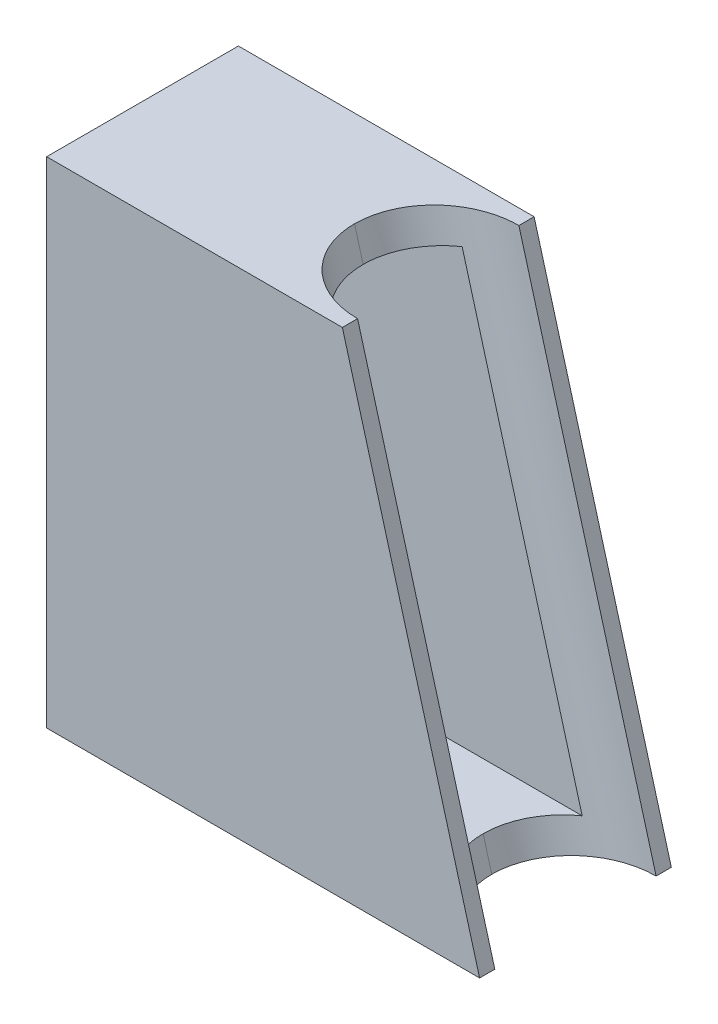
ISO-10303-21;
HEADER;
FILE_DESCRIPTION(('STEP AP214'),'2;1');
FILE_NAME('part.step','',(''),(''),'','','');
FILE_SCHEMA(('AUTOMOTIVE_DESIGN { 1 0 10303 214 1 1 1 1 }'));
ENDSEC;
DATA;
#1=APPLICATION_CONTEXT('core data for automotive mechanical design processes');
#2=APPLICATION_PROTOCOL_DEFINITION('international standard','automotive_design',2000,#1);
#3=PRODUCT_CONTEXT('',#1,'mechanical');
#4=PRODUCT('Part','Part','',(#3));
#5=PRODUCT_RELATED_PRODUCT_CATEGORY('part','',(#4));
#6=PRODUCT_DEFINITION_FORMATION('','',#4);
#7=PRODUCT_DEFINITION_CONTEXT('part definition',#1,'design');
#8=PRODUCT_DEFINITION('design','',#6,#7);
#9=PRODUCT_DEFINITION_SHAPE('','',#8);
#10=(LENGTH_UNIT() NAMED_UNIT(*) SI_UNIT(.MILLI.,.METRE.));
#11=(NAMED_UNIT(*) PLANE_ANGLE_UNIT() SI_UNIT($,.RADIAN.));
#12=(NAMED_UNIT(*) SI_UNIT($,.STERADIAN.) SOLID_ANGLE_UNIT());
#13=UNCERTAINTY_MEASURE_WITH_UNIT(LENGTH_MEASURE(1.E-05),#10,'distance_accuracy_value','');
#14=(GEOMETRIC_REPRESENTATION_CONTEXT(3) GLOBAL_UNCERTAINTY_ASSIGNED_CONTEXT((#13)) GLOBAL_UNIT_ASSIGNED_CONTEXT((#10,
#11,#12)) REPRESENTATION_CONTEXT('',''));
#15=CARTESIAN_POINT('',(0.,0.,0.));
#16=DIRECTION('',(0.,0.,1.));
#17=DIRECTION('',(1.,0.,0.));
#18=AXIS2_PLACEMENT_3D('',#15,#16,#17);
#19=CARTESIAN_POINT('',(-5.55237226107323,-65.915590084916,15.5));
#20=DIRECTION('',(-0.267261394991058,0.963624069203044,0.));
#21=DIRECTION('',(-0.963624069203044,-0.267261394991058,0.));
#22=AXIS2_PLACEMENT_3D('',#19,#20,#21);
#23=CYLINDRICAL_SURFACE('',#22,13.0414448701443);
#24=DIRECTION('',(-0.267261394991058,0.963624069203044,0.));
#25=VECTOR('',#24,1.);
#26=CARTESIAN_POINT('',(-18.1194224351289,-69.4010648336098,15.5));
#27=LINE('',#26,#25);
#28=CARTESIAN_POINT('',(-19.0861197949327,-65.915590084916,15.5));
#29=VERTEX_POINT('',#28);
#30=CARTESIAN_POINT('',(-20.4728711408808,-60.915590084916,15.5));
#31=VERTEX_POINT('',#30);
#32=EDGE_CURVE('E249',#29,#31,#27,.T.);
#33=ORIENTED_EDGE('',*,*,#32,.F.);
#34=CARTESIAN_POINT('',(-5.55237226107325,-65.915590084916,2.45855512985572));
#35=CARTESIAN_POINT('',(-13.4802580166747,-65.9155900849159,2.45855512985571));
#36=CARTESIAN_POINT('',(-19.0861197949327,-65.9155900849159,7.8604984680105));
#37=CARTESIAN_POINT('',(-19.0861197949327,-65.915590084916,15.5));
#38=(BOUNDED_CURVE() B_SPLINE_CURVE(3,(#34,#35,#36,#37),.UNSPECIFIED.,.F.,
.F.) B_SPLINE_CURVE_WITH_KNOTS((4,4),(4.71238898038469,6.28318530717959),
.UNSPECIFIED.) CURVE() GEOMETRIC_REPRESENTATION_ITEM() RATIONAL_B_SPLINE_CURVE((1.,
0.804737854124365,0.804737854124365,1.)) REPRESENTATION_ITEM(''));
#39=CARTESIAN_POINT('',(-5.55237226107325,-65.915590084916,2.45855512985572));
#40=VERTEX_POINT('',#39);
#41=EDGE_CURVE('E215',#40,#29,#38,.T.);
#42=ORIENTED_EDGE('',*,*,#41,.F.);
#43=DIRECTION('',(0.267261394991058,-0.963624069203044,0.));
#44=VECTOR('',#43,1.);
#45=CARTESIAN_POINT('',(-5.55237226107325,-65.915590084916,2.45855512985572));
#46=LINE('',#45,#44);
#47=CARTESIAN_POINT('',(-27.7403937962426,14.084409915084,2.45855512985572));
#48=VERTEX_POINT('',#47);
#49=EDGE_CURVE('E200',#48,#40,#46,.T.);
#50=ORIENTED_EDGE('',*,*,#49,.F.);
#51=CARTESIAN_POINT('',(-41.274141330102,14.084409915084,15.5));
#52=CARTESIAN_POINT('',(-41.274141330102,14.084409915084,7.8604984680105));
#53=CARTESIAN_POINT('',(-35.668279551844,14.084409915084,2.45855512985572));
#54=CARTESIAN_POINT('',(-27.7403937962426,14.084409915084,2.45855512985572));
#55=(BOUNDED_CURVE() B_SPLINE_CURVE(3,(#51,#52,#53,#54),.UNSPECIFIED.,.F.,
.F.) B_SPLINE_CURVE_WITH_KNOTS((4,4),(0.,1.5707963267949),
.UNSPECIFIED.) CURVE() GEOMETRIC_REPRESENTATION_ITEM() RATIONAL_B_SPLINE_CURVE((1.,
0.804737854124365,0.804737854124365,1.)) REPRESENTATION_ITEM(''));
#56=CARTESIAN_POINT('',(-41.274141330102,14.084409915084,15.5));
#57=VERTEX_POINT('',#56);
#58=EDGE_CURVE('E11',#57,#48,#55,.T.);
#59=ORIENTED_EDGE('',*,*,#58,.F.);
#60=DIRECTION('',(-0.267261394991058,0.963624069203044,0.));
#61=VECTOR('',#60,1.);
#62=CARTESIAN_POINT('',(-18.1194224351289,-69.4010648336098,15.5));
#63=LINE('',#62,#61);
#64=CARTESIAN_POINT('',(-39.8873899841539,9.08440991508401,15.5));
#65=VERTEX_POINT('',#64);
#66=EDGE_CURVE('E195',#65,#57,#63,.T.);
#67=ORIENTED_EDGE('',*,*,#66,.F.);
#68=CARTESIAN_POINT('',(-34.3805685504365,9.08440991508402,5.));
#69=CARTESIAN_POINT('',(-37.9100720905667,9.08440991508401,7.50546803179821));
#70=CARTESIAN_POINT('',(-39.8873899841539,9.08440991508401,11.2756716115883));
#71=CARTESIAN_POINT('',(-39.8873899841539,9.08440991508401,15.5));
#72=(BOUNDED_CURVE() B_SPLINE_CURVE(3,(#68,#69,#70,#71),.UNSPECIFIED.,.F.,
.F.) B_SPLINE_CURVE_WITH_KNOTS((4,4),(5.34729824784093,6.28318530717959),
.UNSPECIFIED.) CURVE() GEOMETRIC_REPRESENTATION_ITEM() RATIONAL_B_SPLINE_CURVE((1.,
0.928331832997427,0.928331832997427,1.)) REPRESENTATION_ITEM(''));
#73=CARTESIAN_POINT('',(-34.3805685504365,9.08440991508402,5.));
#74=VERTEX_POINT('',#73);
#75=EDGE_CURVE('E41',#74,#65,#72,.T.);
#76=ORIENTED_EDGE('',*,*,#75,.F.);
#77=DIRECTION('',(-0.267261394991058,0.963624069203044,0.));
#78=VECTOR('',#77,1.);
#79=CARTESIAN_POINT('',(-13.0059458401242,-67.9828407234904,5.));
#80=LINE('',#79,#78);
#81=CARTESIAN_POINT('',(-14.9660497071633,-60.915590084916,5.));
#82=VERTEX_POINT('',#81);
#83=EDGE_CURVE('E164',#82,#74,#80,.T.);
#84=ORIENTED_EDGE('',*,*,#83,.F.);
#85=CARTESIAN_POINT('',(-20.4728711408808,-60.915590084916,15.5));
#86=CARTESIAN_POINT('',(-20.4728711408808,-60.9155900849159,11.2756716115883));
#87=CARTESIAN_POINT('',(-18.4955532472935,-60.9155900849159,7.50546803179821));
#88=CARTESIAN_POINT('',(-14.9660497071633,-60.915590084916,5.));
#89=(BOUNDED_CURVE() B_SPLINE_CURVE(3,(#85,#86,#87,#88),.UNSPECIFIED.,.F.,
.F.) B_SPLINE_CURVE_WITH_KNOTS((4,4),(0.,0.935887059338653),
.UNSPECIFIED.) CURVE() GEOMETRIC_REPRESENTATION_ITEM() RATIONAL_B_SPLINE_CURVE((1.,
0.928331832997427,0.928331832997427,1.)) REPRESENTATION_ITEM(''));
#90=EDGE_CURVE('E54',#31,#82,#89,.T.);
#91=ORIENTED_EDGE('',*,*,#90,.F.);
#92=EDGE_LOOP('',(#33,#42,#50,#59,#67,#76,#84,#91));
#93=FACE_BOUND('',#92,.T.);
#94=ADVANCED_FACE('F17',(#93),#23,.F.);
#95=CARTESIAN_POINT('',(34.4476277389267,14.084409915084,-21.0430808616771));
#96=DIRECTION('',(0.,-1.,0.));
#97=DIRECTION('',(0.,0.,-1.));
#98=AXIS2_PLACEMENT_3D('',#95,#96,#97);
#99=PLANE('',#98);
#100=DIRECTION('',(0.,0.,1.));
#101=VECTOR('',#100,1.);
#102=CARTESIAN_POINT('',(-27.7403937962426,14.084409915084,31.));
#103=LINE('',#102,#101);
#104=CARTESIAN_POINT('',(-27.7403937962426,14.084409915084,28.5414448701443));
#105=VERTEX_POINT('',#104);
#106=CARTESIAN_POINT('',(-27.7403937962426,14.084409915084,31.));
#107=VERTEX_POINT('',#106);
#108=EDGE_CURVE('E235',#105,#107,#103,.T.);
#109=ORIENTED_EDGE('',*,*,#108,.F.);
#110=CARTESIAN_POINT('',(-27.7403937962426,14.084409915084,28.5414448701443));
#111=CARTESIAN_POINT('',(-35.668279551844,14.084409915084,28.5414448701443));
#112=CARTESIAN_POINT('',(-41.274141330102,14.084409915084,23.1395015319895));
#113=CARTESIAN_POINT('',(-41.274141330102,14.084409915084,15.5));
#114=(BOUNDED_CURVE() B_SPLINE_CURVE(3,(#110,#111,#112,#113),.UNSPECIFIED.,.F.,
.F.) B_SPLINE_CURVE_WITH_KNOTS((4,4),(4.71238898038469,6.28318530717959),
.UNSPECIFIED.) CURVE() GEOMETRIC_REPRESENTATION_ITEM() RATIONAL_B_SPLINE_CURVE((1.,
0.804737854124365,0.804737854124365,1.)) REPRESENTATION_ITEM(''));
#115=EDGE_CURVE('E198',#105,#57,#114,.T.);
#116=ORIENTED_EDGE('',*,*,#115,.T.);
#117=ORIENTED_EDGE('',*,*,#58,.T.);
#118=DIRECTION('',(0.,0.,1.));
#119=VECTOR('',#118,1.);
#120=CARTESIAN_POINT('',(-27.7403937962426,14.084409915084,31.));
#121=LINE('',#120,#119);
#122=CARTESIAN_POINT('',(-27.7403937962426,14.084409915084,0.));
#123=VERTEX_POINT('',#122);
#124=EDGE_CURVE('E203',#123,#48,#121,.T.);
#125=ORIENTED_EDGE('',*,*,#124,.F.);
#126=DIRECTION('',(1.,0.,0.));
#127=VECTOR('',#126,1.);
#128=CARTESIAN_POINT('',(0.,14.084409915084,0.));
#129=LINE('',#128,#127);
#130=CARTESIAN_POINT('',(-75.5523722610733,14.084409915084,0.));
#131=VERTEX_POINT('',#130);
#132=EDGE_CURVE('E165',#131,#123,#129,.T.);
#133=ORIENTED_EDGE('',*,*,#132,.F.);
#134=DIRECTION('',(0.,0.,1.));
#135=VECTOR('',#134,1.);
#136=CARTESIAN_POINT('',(-75.5523722610733,14.084409915084,-21.0430808616771));
#137=LINE('',#136,#135);
#138=CARTESIAN_POINT('',(-75.5523722610733,14.084409915084,31.));
#139=VERTEX_POINT('',#138);
#140=EDGE_CURVE('E189',#131,#139,#137,.T.);
#141=ORIENTED_EDGE('',*,*,#140,.T.);
#142=DIRECTION('',(1.,0.,0.));
#143=VECTOR('',#142,1.);
#144=CARTESIAN_POINT('',(0.,14.084409915084,31.));
#145=LINE('',#144,#143);
#146=EDGE_CURVE('E224',#139,#107,#145,.T.);
#147=ORIENTED_EDGE('',*,*,#146,.T.);
#148=EDGE_LOOP('',(#109,#116,#117,#125,#133,#141,#147));
#149=FACE_BOUND('',#148,.T.);
#150=ADVANCED_FACE('F364',(#149),#99,.F.);
#151=CARTESIAN_POINT('',(-60.5523722610733,-170.915590084916,14.6496389415133));
#152=DIRECTION('',(0.,1.,0.));
#153=DIRECTION('',(0.,0.,1.));
#154=AXIS2_PLACEMENT_3D('',#151,#152,#153);
#155=CYLINDRICAL_SURFACE('',#154,6.);
#156=DIRECTION('',(0.,1.,0.));
#157=VECTOR('',#156,1.);
#158=CARTESIAN_POINT('',(-60.5523722610733,-170.915590084916,8.64963894151333));
#159=LINE('',#158,#157);
#160=CARTESIAN_POINT('',(-60.5523722610733,-65.915590084916,8.64963894151336));
#161=VERTEX_POINT('',#160);
#162=CARTESIAN_POINT('',(-60.5523722610733,-60.915590084916,8.64963894151336));
#163=VERTEX_POINT('',#162);
#164=EDGE_CURVE('E287',#161,#163,#159,.T.);
#165=ORIENTED_EDGE('',*,*,#164,.F.);
#166=CARTESIAN_POINT('',(-60.5523722610733,-65.915590084916,14.6496389415134));
#167=DIRECTION('',(0.,1.,0.));
#168=DIRECTION('',(-1.,0.,0.));
#169=AXIS2_PLACEMENT_3D('',#166,#167,#168);
#170=CIRCLE('',#169,6.);
#171=CARTESIAN_POINT('',(-60.5523722610733,-65.915590084916,20.6496389415133));
#172=VERTEX_POINT('',#171);
#173=EDGE_CURVE('E273',#172,#161,#170,.T.);
#174=ORIENTED_EDGE('',*,*,#173,.F.);
#175=DIRECTION('',(0.,1.,0.));
#176=VECTOR('',#175,1.);
#177=CARTESIAN_POINT('',(-60.5523722610733,-170.915590084916,20.6496389415133));
#178=LINE('',#177,#176);
#179=CARTESIAN_POINT('',(-60.5523722610733,-60.915590084916,20.6496389415133));
#180=VERTEX_POINT('',#179);
#181=EDGE_CURVE('E243',#172,#180,#178,.T.);
#182=ORIENTED_EDGE('',*,*,#181,.T.);
#183=CARTESIAN_POINT('',(-60.5523722610733,-60.915590084916,14.6496389415134));
#184=DIRECTION('',(0.,1.,0.));
#185=DIRECTION('',(0.,0.,1.));
#186=AXIS2_PLACEMENT_3D('',#183,#184,#185);
#187=CIRCLE('',#186,6.);
#188=EDGE_CURVE('E27',#180,#163,#187,.T.);
#189=ORIENTED_EDGE('',*,*,#188,.T.);
#190=EDGE_LOOP('',(#165,#174,#182,#189));
#191=FACE_BOUND('',#190,.T.);
#192=ADVANCED_FACE('F323',(#191),#155,.F.);
#193=CARTESIAN_POINT('',(34.4476277389267,-60.915590084916,5.));
#194=DIRECTION('',(0.,-1.,0.));
#195=DIRECTION('',(0.,0.,-1.));
#196=AXIS2_PLACEMENT_3D('',#193,#194,#195);
#197=PLANE('',#196);
#198=ORIENTED_EDGE('',*,*,#188,.F.);
#199=CARTESIAN_POINT('',(-60.5523722610733,-60.915590084916,14.6496389415134));
#200=DIRECTION('',(0.,1.,0.));
#201=DIRECTION('',(0.,0.,1.));
#202=AXIS2_PLACEMENT_3D('',#199,#200,#201);
#203=CIRCLE('',#202,6.);
#204=EDGE_CURVE('E283',#163,#180,#203,.T.);
#205=ORIENTED_EDGE('',*,*,#204,.F.);
#206=EDGE_LOOP('',(#198,#205));
#207=FACE_BOUND('',#206,.T.);
#208=DIRECTION('',(-1.,0.,0.));
#209=VECTOR('',#208,1.);
#210=CARTESIAN_POINT('',(34.4476277389267,-60.915590084916,26.));
#211=LINE('',#210,#209);
#212=CARTESIAN_POINT('',(-14.9660497071633,-60.915590084916,26.));
#213=VERTEX_POINT('',#212);
#214=CARTESIAN_POINT('',(-75.5523722610733,-60.915590084916,26.));
#215=VERTEX_POINT('',#214);
#216=EDGE_CURVE('E205',#213,#215,#211,.T.);
#217=ORIENTED_EDGE('',*,*,#216,.F.);
#218=CARTESIAN_POINT('',(-14.9660497071633,-60.915590084916,26.));
#219=CARTESIAN_POINT('',(-18.4955532472935,-60.915590084916,23.4945319682018));
#220=CARTESIAN_POINT('',(-20.4728711408808,-60.915590084916,19.7243283884117));
#221=CARTESIAN_POINT('',(-20.4728711408808,-60.915590084916,15.5));
#222=(BOUNDED_CURVE() B_SPLINE_CURVE(3,(#218,#219,#220,#221),.UNSPECIFIED.,.F.,
.F.) B_SPLINE_CURVE_WITH_KNOTS((4,4),(5.34729824784093,6.28318530717958),
.UNSPECIFIED.) CURVE() GEOMETRIC_REPRESENTATION_ITEM() RATIONAL_B_SPLINE_CURVE((1.,
0.928331832997426,0.928331832997426,1.)) REPRESENTATION_ITEM(''));
#223=EDGE_CURVE('E244',#213,#31,#222,.T.);
#224=ORIENTED_EDGE('',*,*,#223,.T.);
#225=ORIENTED_EDGE('',*,*,#90,.T.);
#226=DIRECTION('',(-1.,0.,0.));
#227=VECTOR('',#226,1.);
#228=CARTESIAN_POINT('',(34.4476277389267,-60.915590084916,5.));
#229=LINE('',#228,#227);
#230=CARTESIAN_POINT('',(-75.5523722610733,-60.915590084916,5.));
#231=VERTEX_POINT('',#230);
#232=EDGE_CURVE('E156',#82,#231,#229,.T.);
#233=ORIENTED_EDGE('',*,*,#232,.T.);
#234=DIRECTION('',(0.,0.,1.));
#235=VECTOR('',#234,1.);
#236=CARTESIAN_POINT('',(-75.5523722610733,-60.915590084916,5.));
#237=LINE('',#236,#235);
#238=EDGE_CURVE('E160',#231,#215,#237,.T.);
#239=ORIENTED_EDGE('',*,*,#238,.T.);
#240=EDGE_LOOP('',(#217,#224,#225,#233,#239));
#241=FACE_BOUND('',#240,.T.);
#242=ADVANCED_FACE('F158',(#207,#241),#197,.F.);
#243=CARTESIAN_POINT('',(34.4476277389267,9.08440991508402,26.));
#244=DIRECTION('',(0.,0.,1.));
#245=DIRECTION('',(0.,-1.,0.));
#246=AXIS2_PLACEMENT_3D('',#243,#244,#245);
#247=PLANE('',#246);
#248=DIRECTION('',(-1.,0.,0.));
#249=VECTOR('',#248,1.);
#250=CARTESIAN_POINT('',(34.4476277389267,9.08440991508402,26.));
#251=LINE('',#250,#249);
#252=CARTESIAN_POINT('',(-34.3805685504364,9.08440991508399,26.));
#253=VERTEX_POINT('',#252);
#254=CARTESIAN_POINT('',(-75.5523722610733,9.08440991508402,26.));
#255=VERTEX_POINT('',#254);
#256=EDGE_CURVE('E208',#253,#255,#251,.T.);
#257=ORIENTED_EDGE('',*,*,#256,.F.);
#258=DIRECTION('',(0.267261394991058,-0.963624069203044,0.));
#259=VECTOR('',#258,1.);
#260=CARTESIAN_POINT('',(-13.0059458401242,-67.9828407234904,26.));
#261=LINE('',#260,#259);
#262=EDGE_CURVE('E214',#253,#213,#261,.T.);
#263=ORIENTED_EDGE('',*,*,#262,.T.);
#264=ORIENTED_EDGE('',*,*,#216,.T.);
#265=DIRECTION('',(0.,1.,0.));
#266=VECTOR('',#265,1.);
#267=CARTESIAN_POINT('',(-75.5523722610733,9.08440991508402,26.));
#268=LINE('',#267,#266);
#269=EDGE_CURVE('E180',#215,#255,#268,.T.);
#270=ORIENTED_EDGE('',*,*,#269,.T.);
#271=EDGE_LOOP('',(#257,#263,#264,#270));
#272=FACE_BOUND('',#271,.T.);
#273=ADVANCED_FACE('F398',(#272),#247,.F.);
#274=CARTESIAN_POINT('',(34.4476277389267,9.08440991508402,5.));
#275=DIRECTION('',(0.,1.,0.));
#276=DIRECTION('',(1.,0.,0.));
#277=AXIS2_PLACEMENT_3D('',#274,#275,#276);
#278=PLANE('',#277);
#279=DIRECTION('',(-1.,0.,0.));
#280=VECTOR('',#279,1.);
#281=CARTESIAN_POINT('',(34.4476277389267,9.08440991508402,5.));
#282=LINE('',#281,#280);
#283=CARTESIAN_POINT('',(-75.5523722610733,9.08440991508402,5.));
#284=VERTEX_POINT('',#283);
#285=EDGE_CURVE('E21',#74,#284,#282,.T.);
#286=ORIENTED_EDGE('',*,*,#285,.F.);
#287=ORIENTED_EDGE('',*,*,#75,.T.);
#288=CARTESIAN_POINT('',(-39.8873899841539,9.08440991508401,15.5));
#289=CARTESIAN_POINT('',(-39.8873899841539,9.08440991508401,19.7243283884117));
#290=CARTESIAN_POINT('',(-37.9100720905667,9.08440991508401,23.4945319682018));
#291=CARTESIAN_POINT('',(-34.3805685504364,9.08440991508399,26.));
#292=(BOUNDED_CURVE() B_SPLINE_CURVE(3,(#288,#289,#290,#291),.UNSPECIFIED.,.F.,
.F.) B_SPLINE_CURVE_WITH_KNOTS((4,4),(0.,0.935887059338657),
.UNSPECIFIED.) CURVE() GEOMETRIC_REPRESENTATION_ITEM() RATIONAL_B_SPLINE_CURVE((1.,
0.928331832997426,0.928331832997426,1.)) REPRESENTATION_ITEM(''));
#293=EDGE_CURVE('E199',#65,#253,#292,.T.);
#294=ORIENTED_EDGE('',*,*,#293,.T.);
#295=ORIENTED_EDGE('',*,*,#256,.T.);
#296=DIRECTION('',(0.,0.,-1.));
#297=VECTOR('',#296,1.);
#298=CARTESIAN_POINT('',(-75.5523722610733,9.08440991508402,5.));
#299=LINE('',#298,#297);
#300=EDGE_CURVE('E174',#255,#284,#299,.T.);
#301=ORIENTED_EDGE('',*,*,#300,.T.);
#302=EDGE_LOOP('',(#286,#287,#294,#295,#301));
#303=FACE_BOUND('',#302,.T.);
#304=ADVANCED_FACE('F401',(#303),#278,.F.);
#305=CARTESIAN_POINT('',(34.4476277389267,9.08440991508402,5.));
#306=DIRECTION('',(0.,0.,-1.));
#307=DIRECTION('',(0.,-1.,0.));
#308=AXIS2_PLACEMENT_3D('',#305,#306,#307);
#309=PLANE('',#308);
#310=ORIENTED_EDGE('',*,*,#232,.F.);
#311=ORIENTED_EDGE('',*,*,#83,.T.);
#312=ORIENTED_EDGE('',*,*,#285,.T.);
#313=DIRECTION('',(0.,-1.,0.));
#314=VECTOR('',#313,1.);
#315=CARTESIAN_POINT('',(-75.5523722610733,9.08440991508402,5.));
#316=LINE('',#315,#314);
#317=EDGE_CURVE('E168',#284,#231,#316,.T.);
#318=ORIENTED_EDGE('',*,*,#317,.T.);
#319=EDGE_LOOP('',(#310,#311,#312,#318));
#320=FACE_BOUND('',#319,.T.);
#321=ADVANCED_FACE('F169',(#320),#309,.F.);
#322=CARTESIAN_POINT('',(0.,0.,0.));
#323=DIRECTION('',(0.,0.,1.));
#324=DIRECTION('',(1.,0.,0.));
#325=AXIS2_PLACEMENT_3D('',#322,#323,#324);
#326=PLANE('',#325);
#327=DIRECTION('',(0.,-1.,0.));
#328=VECTOR('',#327,1.);
#329=CARTESIAN_POINT('',(-75.5523722610733,34.084409915084,0.));
#330=LINE('',#329,#328);
#331=CARTESIAN_POINT('',(-75.5523722610733,-65.915590084916,0.));
#332=VERTEX_POINT('',#331);
#333=EDGE_CURVE('E182',#131,#332,#330,.T.);
#334=ORIENTED_EDGE('',*,*,#333,.F.);
#335=ORIENTED_EDGE('',*,*,#132,.T.);
#336=DIRECTION('',(-0.267261394991058,0.963624069203044,0.));
#337=VECTOR('',#336,1.);
#338=CARTESIAN_POINT('',(-5.55237226107326,-65.915590084916,0.));
#339=LINE('',#338,#337);
#340=CARTESIAN_POINT('',(-5.55237226107326,-65.915590084916,0.));
#341=VERTEX_POINT('',#340);
#342=EDGE_CURVE('E202',#341,#123,#339,.T.);
#343=ORIENTED_EDGE('',*,*,#342,.F.);
#344=DIRECTION('',(1.,0.,0.));
#345=VECTOR('',#344,1.);
#346=CARTESIAN_POINT('',(-5.55237226107326,-65.915590084916,0.));
#347=LINE('',#346,#345);
#348=EDGE_CURVE('E266',#332,#341,#347,.T.);
#349=ORIENTED_EDGE('',*,*,#348,.F.);
#350=EDGE_LOOP('',(#334,#335,#343,#349));
#351=FACE_BOUND('',#350,.T.);
#352=ADVANCED_FACE('F361',(#351),#326,.F.);
#353=CARTESIAN_POINT('',(0.,0.,31.));
#354=DIRECTION('',(0.,0.,1.));
#355=DIRECTION('',(1.,0.,0.));
#356=AXIS2_PLACEMENT_3D('',#353,#354,#355);
#357=PLANE('',#356);
#358=ORIENTED_EDGE('',*,*,#146,.F.);
#359=DIRECTION('',(0.,-1.,0.));
#360=VECTOR('',#359,1.);
#361=CARTESIAN_POINT('',(-75.5523722610733,34.084409915084,31.));
#362=LINE('',#361,#360);
#363=CARTESIAN_POINT('',(-75.5523722610733,-65.915590084916,31.));
#364=VERTEX_POINT('',#363);
#365=EDGE_CURVE('E257',#139,#364,#362,.T.);
#366=ORIENTED_EDGE('',*,*,#365,.T.);
#367=DIRECTION('',(1.,0.,0.));
#368=VECTOR('',#367,1.);
#369=CARTESIAN_POINT('',(-5.55237226107326,-65.915590084916,31.));
#370=LINE('',#369,#368);
#371=CARTESIAN_POINT('',(-5.55237226107326,-65.915590084916,31.));
#372=VERTEX_POINT('',#371);
#373=EDGE_CURVE('E223',#364,#372,#370,.T.);
#374=ORIENTED_EDGE('',*,*,#373,.T.);
#375=DIRECTION('',(-0.267261394991058,0.963624069203044,0.));
#376=VECTOR('',#375,1.);
#377=CARTESIAN_POINT('',(-5.55237226107326,-65.915590084916,31.));
#378=LINE('',#377,#376);
#379=EDGE_CURVE('E239',#372,#107,#378,.T.);
#380=ORIENTED_EDGE('',*,*,#379,.T.);
#381=EDGE_LOOP('',(#358,#366,#374,#380));
#382=FACE_BOUND('',#381,.T.);
#383=ADVANCED_FACE('F414',(#382),#357,.T.);
#384=CARTESIAN_POINT('',(-75.5523722610733,34.084409915084,31.));
#385=DIRECTION('',(1.,0.,0.));
#386=DIRECTION('',(0.,1.,0.));
#387=AXIS2_PLACEMENT_3D('',#384,#385,#386);
#388=PLANE('',#387);
#389=ORIENTED_EDGE('',*,*,#238,.F.);
#390=ORIENTED_EDGE('',*,*,#317,.F.);
#391=ORIENTED_EDGE('',*,*,#300,.F.);
#392=ORIENTED_EDGE('',*,*,#269,.F.);
#393=EDGE_LOOP('',(#389,#390,#391,#392));
#394=FACE_BOUND('',#393,.T.);
#395=ORIENTED_EDGE('',*,*,#365,.F.);
#396=ORIENTED_EDGE('',*,*,#140,.F.);
#397=ORIENTED_EDGE('',*,*,#333,.T.);
#398=DIRECTION('',(0.,0.,-1.));
#399=VECTOR('',#398,1.);
#400=CARTESIAN_POINT('',(-75.5523722610733,-65.915590084916,31.));
#401=LINE('',#400,#399);
#402=EDGE_CURVE('E232',#364,#332,#401,.T.);
#403=ORIENTED_EDGE('',*,*,#402,.F.);
#404=EDGE_LOOP('',(#395,#396,#397,#403));
#405=FACE_BOUND('',#404,.T.);
#406=ADVANCED_FACE('F177',(#394,#405),#388,.F.);
#407=CARTESIAN_POINT('',(-5.55237226107326,-65.915590084916,31.));
#408=DIRECTION('',(-0.963624069203044,-0.267261394991058,0.));
#409=DIRECTION('',(-0.267261394991058,0.963624069203044,0.));
#410=AXIS2_PLACEMENT_3D('',#407,#408,#409);
#411=PLANE('',#410);
#412=ORIENTED_EDGE('',*,*,#124,.T.);
#413=ORIENTED_EDGE('',*,*,#49,.T.);
#414=DIRECTION('',(0.,0.,-1.));
#415=VECTOR('',#414,1.);
#416=CARTESIAN_POINT('',(-5.55237226107326,-65.915590084916,31.));
#417=LINE('',#416,#415);
#418=EDGE_CURVE('E193',#40,#341,#417,.T.);
#419=ORIENTED_EDGE('',*,*,#418,.T.);
#420=ORIENTED_EDGE('',*,*,#342,.T.);
#421=EDGE_LOOP('',(#412,#413,#419,#420));
#422=FACE_BOUND('',#421,.T.);
#423=ADVANCED_FACE('F350',(#422),#411,.F.);
#424=CARTESIAN_POINT('',(-5.55237226107326,-65.915590084916,31.));
#425=DIRECTION('',(0.,1.,0.));
#426=DIRECTION('',(1.,0.,0.));
#427=AXIS2_PLACEMENT_3D('',#424,#425,#426);
#428=PLANE('',#427);
#429=ORIENTED_EDGE('',*,*,#173,.T.);
#430=CARTESIAN_POINT('',(-60.5523722610733,-65.915590084916,14.6496389415134));
#431=DIRECTION('',(0.,1.,0.));
#432=DIRECTION('',(-1.,0.,0.));
#433=AXIS2_PLACEMENT_3D('',#430,#431,#432);
#434=CIRCLE('',#433,6.);
#435=EDGE_CURVE('E282',#161,#172,#434,.T.);
#436=ORIENTED_EDGE('',*,*,#435,.T.);
#437=EDGE_LOOP('',(#429,#436));
#438=FACE_BOUND('',#437,.T.);
#439=ORIENTED_EDGE('',*,*,#418,.F.);
#440=ORIENTED_EDGE('',*,*,#41,.T.);
#441=CARTESIAN_POINT('',(-19.0861197949327,-65.915590084916,15.5));
#442=CARTESIAN_POINT('',(-19.0861197949327,-65.9155900849159,23.1395015319895));
#443=CARTESIAN_POINT('',(-13.4802580166747,-65.9155900849159,28.5414448701443));
#444=CARTESIAN_POINT('',(-5.55237226107325,-65.915590084916,28.5414448701443));
#445=(BOUNDED_CURVE() B_SPLINE_CURVE(3,(#441,#442,#443,#444),.UNSPECIFIED.,.F.,
.F.) B_SPLINE_CURVE_WITH_KNOTS((4,4),(0.,1.5707963267949),
.UNSPECIFIED.) CURVE() GEOMETRIC_REPRESENTATION_ITEM() RATIONAL_B_SPLINE_CURVE((1.,
0.804737854124365,0.804737854124365,1.)) REPRESENTATION_ITEM(''));
#446=CARTESIAN_POINT('',(-5.55237226107325,-65.915590084916,28.5414448701443));
#447=VERTEX_POINT('',#446);
#448=EDGE_CURVE('E291',#29,#447,#445,.T.);
#449=ORIENTED_EDGE('',*,*,#448,.T.);
#450=DIRECTION('',(0.,0.,-1.));
#451=VECTOR('',#450,1.);
#452=CARTESIAN_POINT('',(-5.55237226107326,-65.915590084916,31.));
#453=LINE('',#452,#451);
#454=EDGE_CURVE('E240',#372,#447,#453,.T.);
#455=ORIENTED_EDGE('',*,*,#454,.F.);
#456=ORIENTED_EDGE('',*,*,#373,.F.);
#457=ORIENTED_EDGE('',*,*,#402,.T.);
#458=ORIENTED_EDGE('',*,*,#348,.T.);
#459=EDGE_LOOP('',(#439,#440,#449,#455,#456,#457,#458));
#460=FACE_BOUND('',#459,.T.);
#461=ADVANCED_FACE('F316',(#438,#460),#428,.F.);
#462=CARTESIAN_POINT('',(-5.55237226107326,-65.915590084916,31.));
#463=DIRECTION('',(-0.963624069203044,-0.267261394991058,0.));
#464=DIRECTION('',(-0.267261394991058,0.963624069203044,0.));
#465=AXIS2_PLACEMENT_3D('',#462,#463,#464);
#466=PLANE('',#465);
#467=ORIENTED_EDGE('',*,*,#454,.T.);
#468=DIRECTION('',(-0.267261394991058,0.963624069203044,0.));
#469=VECTOR('',#468,1.);
#470=CARTESIAN_POINT('',(-5.55237226107325,-65.915590084916,28.5414448701443));
#471=LINE('',#470,#469);
#472=EDGE_CURVE('E265',#447,#105,#471,.T.);
#473=ORIENTED_EDGE('',*,*,#472,.T.);
#474=ORIENTED_EDGE('',*,*,#108,.T.);
#475=ORIENTED_EDGE('',*,*,#379,.F.);
#476=EDGE_LOOP('',(#467,#473,#474,#475));
#477=FACE_BOUND('',#476,.T.);
#478=ADVANCED_FACE('F428',(#477),#466,.F.);
#479=CARTESIAN_POINT('',(-60.5523722610733,-170.915590084916,14.6496389415133));
#480=DIRECTION('',(0.,1.,0.));
#481=DIRECTION('',(0.,0.,1.));
#482=AXIS2_PLACEMENT_3D('',#479,#480,#481);
#483=CYLINDRICAL_SURFACE('',#482,6.);
#484=ORIENTED_EDGE('',*,*,#435,.F.);
#485=ORIENTED_EDGE('',*,*,#164,.T.);
#486=ORIENTED_EDGE('',*,*,#204,.T.);
#487=ORIENTED_EDGE('',*,*,#181,.F.);
#488=EDGE_LOOP('',(#484,#485,#486,#487));
#489=FACE_BOUND('',#488,.T.);
#490=ADVANCED_FACE('F328',(#489),#483,.F.);
#491=CARTESIAN_POINT('',(-5.55237226107323,-65.915590084916,15.5));
#492=DIRECTION('',(-0.267261394991058,0.963624069203044,0.));
#493=DIRECTION('',(-0.963624069203044,-0.267261394991058,0.));
#494=AXIS2_PLACEMENT_3D('',#491,#492,#493);
#495=CYLINDRICAL_SURFACE('',#494,13.0414448701443);
#496=ORIENTED_EDGE('',*,*,#448,.F.);
#497=ORIENTED_EDGE('',*,*,#32,.T.);
#498=ORIENTED_EDGE('',*,*,#223,.F.);
#499=ORIENTED_EDGE('',*,*,#262,.F.);
#500=ORIENTED_EDGE('',*,*,#293,.F.);
#501=ORIENTED_EDGE('',*,*,#66,.T.);
#502=ORIENTED_EDGE('',*,*,#115,.F.);
#503=ORIENTED_EDGE('',*,*,#472,.F.);
#504=EDGE_LOOP('',(#496,#497,#498,#499,#500,#501,#502,#503));
#505=FACE_BOUND('',#504,.T.);
#506=ADVANCED_FACE('F19',(#505),#495,.F.);
#507=CLOSED_SHELL('',(#94,#150,#192,#242,#273,#304,#321,#352,#383,#406,#423,#461,#478,#490,#506));
#508=MANIFOLD_SOLID_BREP('B1',#507);
#509=ADVANCED_BREP_SHAPE_REPRESENTATION('',(#18,#508),#14);
#510=SHAPE_DEFINITION_REPRESENTATION(#9,#509);
ENDSEC;
END-ISO-10303-21;
